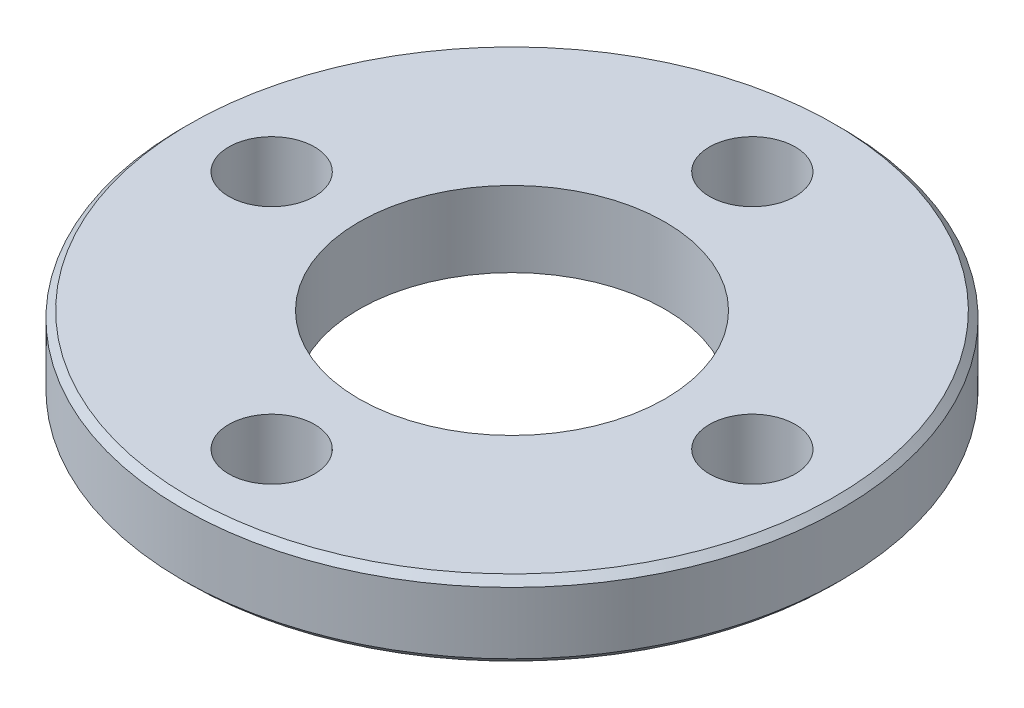
ISO-10303-21;
HEADER;
FILE_DESCRIPTION(('STEP AP214'),'2;1');
FILE_NAME('part.step','',(''),(''),'','','');
FILE_SCHEMA(('AUTOMOTIVE_DESIGN { 1 0 10303 214 1 1 1 1 }'));
ENDSEC;
DATA;
#1=APPLICATION_CONTEXT('core data for automotive mechanical design processes');
#2=APPLICATION_PROTOCOL_DEFINITION('international standard','automotive_design',2000,#1);
#3=PRODUCT_CONTEXT('',#1,'mechanical');
#4=PRODUCT('Part','Part','',(#3));
#5=PRODUCT_RELATED_PRODUCT_CATEGORY('part','',(#4));
#6=PRODUCT_DEFINITION_FORMATION('','',#4);
#7=PRODUCT_DEFINITION_CONTEXT('part definition',#1,'design');
#8=PRODUCT_DEFINITION('design','',#6,#7);
#9=PRODUCT_DEFINITION_SHAPE('','',#8);
#10=(LENGTH_UNIT() NAMED_UNIT(*) SI_UNIT(.MILLI.,.METRE.));
#11=(NAMED_UNIT(*) PLANE_ANGLE_UNIT() SI_UNIT($,.RADIAN.));
#12=(NAMED_UNIT(*) SI_UNIT($,.STERADIAN.) SOLID_ANGLE_UNIT());
#13=UNCERTAINTY_MEASURE_WITH_UNIT(LENGTH_MEASURE(1.E-05),#10,'distance_accuracy_value','');
#14=(GEOMETRIC_REPRESENTATION_CONTEXT(3) GLOBAL_UNCERTAINTY_ASSIGNED_CONTEXT((#13)) GLOBAL_UNIT_ASSIGNED_CONTEXT((#10,
#11,#12)) REPRESENTATION_CONTEXT('',''));
#15=CARTESIAN_POINT('',(0.,0.,0.));
#16=DIRECTION('',(0.,0.,1.));
#17=DIRECTION('',(1.,0.,0.));
#18=AXIS2_PLACEMENT_3D('',#15,#16,#17);
#19=CARTESIAN_POINT('',(6.99999812689985,-18.112,0.));
#20=DIRECTION('',(0.,1.,0.));
#21=DIRECTION('',(0.,0.,1.));
#22=AXIS2_PLACEMENT_3D('',#19,#20,#21);
#23=CYLINDRICAL_SURFACE('',#22,1.25);
#24=CARTESIAN_POINT('',(6.99999812689985,-18.05,0.));
#25=DIRECTION('',(0.,-1.,0.));
#26=DIRECTION('',(0.,0.,-1.));
#27=AXIS2_PLACEMENT_3D('',#24,#25,#26);
#28=CIRCLE('',#27,1.25);
#29=CARTESIAN_POINT('',(6.99999812689985,-18.05,-1.25));
#30=VERTEX_POINT('',#29);
#31=EDGE_CURVE('E219',#30,#30,#28,.T.);
#32=ORIENTED_EDGE('',*,*,#31,.T.);
#33=DIRECTION('',(0.,1.,0.));
#34=VECTOR('',#33,1.);
#35=CARTESIAN_POINT('',(6.99999812689985,-18.112,-1.25));
#36=LINE('',#35,#34);
#37=CARTESIAN_POINT('',(6.99999812689983,-15.85,-1.25));
#38=VERTEX_POINT('',#37);
#39=EDGE_CURVE('E11',#30,#38,#36,.T.);
#40=ORIENTED_EDGE('',*,*,#39,.T.);
#41=CARTESIAN_POINT('',(6.99999812689983,-15.85,0.));
#42=DIRECTION('',(0.,1.,0.));
#43=DIRECTION('',(0.,0.,1.));
#44=AXIS2_PLACEMENT_3D('',#41,#42,#43);
#45=CIRCLE('',#44,1.25);
#46=EDGE_CURVE('E173',#38,#38,#45,.T.);
#47=ORIENTED_EDGE('',*,*,#46,.T.);
#48=ORIENTED_EDGE('',*,*,#39,.F.);
#49=EDGE_LOOP('',(#32,#40,#47,#48));
#50=FACE_BOUND('',#49,.T.);
#51=ADVANCED_FACE('F54',(#50),#23,.F.);
#52=CARTESIAN_POINT('',(-1.52655665885959E-13,-18.1120000000001,6.9999981269));
#53=DIRECTION('',(0.,1.,0.));
#54=DIRECTION('',(-1.,0.,0.));
#55=AXIS2_PLACEMENT_3D('',#52,#53,#54);
#56=CYLINDRICAL_SURFACE('',#55,1.25);
#57=CARTESIAN_POINT('',(-1.52655665885959E-13,-18.0500000000001,6.9999981269));
#58=DIRECTION('',(0.,-1.,0.));
#59=DIRECTION('',(1.,0.,0.));
#60=AXIS2_PLACEMENT_3D('',#57,#58,#59);
#61=CIRCLE('',#60,1.25);
#62=CARTESIAN_POINT('',(1.24999999999985,-18.0500000000001,6.9999981269));
#63=VERTEX_POINT('',#62);
#64=EDGE_CURVE('E224',#63,#63,#61,.T.);
#65=ORIENTED_EDGE('',*,*,#64,.T.);
#66=DIRECTION('',(0.,1.,0.));
#67=VECTOR('',#66,1.);
#68=CARTESIAN_POINT('',(1.24999999999985,-18.1120000000001,6.9999981269));
#69=LINE('',#68,#67);
#70=CARTESIAN_POINT('',(1.24999999999983,-15.8500000000001,6.9999981269));
#71=VERTEX_POINT('',#70);
#72=EDGE_CURVE('E61',#63,#71,#69,.T.);
#73=ORIENTED_EDGE('',*,*,#72,.T.);
#74=CARTESIAN_POINT('',(-1.6826817716975E-13,-15.8500000000001,6.9999981269));
#75=DIRECTION('',(0.,1.,0.));
#76=DIRECTION('',(-1.,0.,0.));
#77=AXIS2_PLACEMENT_3D('',#74,#75,#76);
#78=CIRCLE('',#77,1.25);
#79=EDGE_CURVE('E167',#71,#71,#78,.T.);
#80=ORIENTED_EDGE('',*,*,#79,.T.);
#81=ORIENTED_EDGE('',*,*,#72,.F.);
#82=EDGE_LOOP('',(#65,#73,#80,#81));
#83=FACE_BOUND('',#82,.T.);
#84=ADVANCED_FACE('F281',(#83),#56,.F.);
#85=CARTESIAN_POINT('',(-6.99999812690015,-18.1120000000001,0.));
#86=DIRECTION('',(0.,1.,0.));
#87=DIRECTION('',(0.,0.,-1.));
#88=AXIS2_PLACEMENT_3D('',#85,#86,#87);
#89=CYLINDRICAL_SURFACE('',#88,1.25);
#90=CARTESIAN_POINT('',(-6.99999812690015,-18.0500000000001,0.));
#91=DIRECTION('',(0.,-1.,0.));
#92=DIRECTION('',(0.,0.,1.));
#93=AXIS2_PLACEMENT_3D('',#90,#91,#92);
#94=CIRCLE('',#93,1.25);
#95=CARTESIAN_POINT('',(-6.99999812690015,-18.0500000000001,1.25));
#96=VERTEX_POINT('',#95);
#97=EDGE_CURVE('E229',#96,#96,#94,.T.);
#98=ORIENTED_EDGE('',*,*,#97,.T.);
#99=DIRECTION('',(0.,1.,0.));
#100=VECTOR('',#99,1.);
#101=CARTESIAN_POINT('',(-6.99999812690015,-18.1120000000001,1.25));
#102=LINE('',#101,#100);
#103=CARTESIAN_POINT('',(-6.99999812690017,-15.8500000000001,1.25));
#104=VERTEX_POINT('',#103);
#105=EDGE_CURVE('E177',#96,#104,#102,.T.);
#106=ORIENTED_EDGE('',*,*,#105,.T.);
#107=CARTESIAN_POINT('',(-6.99999812690017,-15.8500000000001,0.));
#108=DIRECTION('',(0.,1.,0.));
#109=DIRECTION('',(0.,0.,-1.));
#110=AXIS2_PLACEMENT_3D('',#107,#108,#109);
#111=CIRCLE('',#110,1.25);
#112=EDGE_CURVE('E168',#104,#104,#111,.T.);
#113=ORIENTED_EDGE('',*,*,#112,.T.);
#114=ORIENTED_EDGE('',*,*,#105,.F.);
#115=EDGE_LOOP('',(#98,#106,#113,#114));
#116=FACE_BOUND('',#115,.T.);
#117=ADVANCED_FACE('F287',(#116),#89,.F.);
#118=CARTESIAN_POINT('',(-1.52655665885959E-13,-18.1120000000001,-6.9999981269));
#119=DIRECTION('',(0.,1.,0.));
#120=DIRECTION('',(1.,0.,0.));
#121=AXIS2_PLACEMENT_3D('',#118,#119,#120);
#122=CYLINDRICAL_SURFACE('',#121,1.25);
#123=CARTESIAN_POINT('',(-1.52655665885959E-13,-18.0500000000001,-6.9999981269));
#124=DIRECTION('',(0.,-1.,0.));
#125=DIRECTION('',(-1.,0.,0.));
#126=AXIS2_PLACEMENT_3D('',#123,#124,#125);
#127=CIRCLE('',#126,1.25);
#128=CARTESIAN_POINT('',(-1.25000000000015,-18.0500000000001,-6.9999981269));
#129=VERTEX_POINT('',#128);
#130=EDGE_CURVE('E222',#129,#129,#127,.T.);
#131=ORIENTED_EDGE('',*,*,#130,.T.);
#132=DIRECTION('',(0.,1.,0.));
#133=VECTOR('',#132,1.);
#134=CARTESIAN_POINT('',(-1.25000000000015,-18.1120000000001,-6.9999981269));
#135=LINE('',#134,#133);
#136=CARTESIAN_POINT('',(-1.25000000000017,-15.8500000000001,-6.9999981269));
#137=VERTEX_POINT('',#136);
#138=EDGE_CURVE('E176',#129,#137,#135,.T.);
#139=ORIENTED_EDGE('',*,*,#138,.T.);
#140=CARTESIAN_POINT('',(-1.6826817716975E-13,-15.8500000000001,-6.9999981269));
#141=DIRECTION('',(0.,1.,0.));
#142=DIRECTION('',(1.,0.,0.));
#143=AXIS2_PLACEMENT_3D('',#140,#141,#142);
#144=CIRCLE('',#143,1.25);
#145=EDGE_CURVE('E162',#137,#137,#144,.T.);
#146=ORIENTED_EDGE('',*,*,#145,.T.);
#147=ORIENTED_EDGE('',*,*,#138,.F.);
#148=EDGE_LOOP('',(#131,#139,#146,#147));
#149=FACE_BOUND('',#148,.T.);
#150=ADVANCED_FACE('F295',(#149),#122,.F.);
#151=CARTESIAN_POINT('',(-1.6826817716975E-13,-15.8500000000001,0.));
#152=DIRECTION('',(0.,-1.,0.));
#153=DIRECTION('',(-1.,0.,0.));
#154=AXIS2_PLACEMENT_3D('',#151,#152,#153);
#155=PLANE('',#154);
#156=ORIENTED_EDGE('',*,*,#46,.F.);
#157=EDGE_LOOP('',(#156));
#158=FACE_BOUND('',#157,.T.);
#159=ORIENTED_EDGE('',*,*,#79,.F.);
#160=EDGE_LOOP('',(#159));
#161=FACE_BOUND('',#160,.T.);
#162=ORIENTED_EDGE('',*,*,#112,.F.);
#163=EDGE_LOOP('',(#162));
#164=FACE_BOUND('',#163,.T.);
#165=ORIENTED_EDGE('',*,*,#145,.F.);
#166=EDGE_LOOP('',(#165));
#167=FACE_BOUND('',#166,.T.);
#168=CARTESIAN_POINT('',(1.1095E-13,-15.8500000000001,0.));
#169=DIRECTION('',(0.,-1.,0.));
#170=DIRECTION('',(1.,0.,0.));
#171=AXIS2_PLACEMENT_3D('',#168,#169,#170);
#172=CIRCLE('',#171,4.45999999999972);
#173=CARTESIAN_POINT('',(4.45999999999983,-15.85,0.));
#174=VERTEX_POINT('',#173);
#175=EDGE_CURVE('E250',#174,#174,#172,.T.);
#176=ORIENTED_EDGE('',*,*,#175,.T.);
#177=EDGE_LOOP('',(#176));
#178=FACE_BOUND('',#177,.T.);
#179=CARTESIAN_POINT('',(-1.6826817716975E-13,-15.8500000000001,0.));
#180=DIRECTION('',(0.,-1.,0.));
#181=DIRECTION('',(1.,0.,0.));
#182=AXIS2_PLACEMENT_3D('',#179,#180,#181);
#183=CIRCLE('',#182,9.400000000004);
#184=CARTESIAN_POINT('',(-1.6826817716975E-13,-15.8500000000001,9.400000000004));
#185=VERTEX_POINT('',#184);
#186=EDGE_CURVE('E160',#185,#185,#183,.T.);
#187=ORIENTED_EDGE('',*,*,#186,.F.);
#188=EDGE_LOOP('',(#187));
#189=FACE_BOUND('',#188,.T.);
#190=ADVANCED_FACE('F293',(#158,#161,#164,#167,#178,#189),#155,.F.);
#191=CARTESIAN_POINT('',(-1.66533453693773E-13,-15.9500000000001,0.));
#192=DIRECTION('',(0.,-1.,0.));
#193=DIRECTION('',(0.,0.,-1.));
#194=AXIS2_PLACEMENT_3D('',#191,#192,#193);
#195=CONICAL_SURFACE('',#194,9.500000000004,0.785398163395);
#196=CARTESIAN_POINT('',(-1.66533453693773E-13,-16.0500000000001,0.));
#197=DIRECTION('',(0.,-1.,0.));
#198=DIRECTION('',(1.,0.,1.5111036E-10));
#199=AXIS2_PLACEMENT_3D('',#196,#197,#198);
#200=CIRCLE('',#199,9.600000000004);
#201=CARTESIAN_POINT('',(-1.66533453693773E-13,-16.0500000000001,9.600000000004));
#202=VERTEX_POINT('',#201);
#203=CARTESIAN_POINT('',(9.59999999999983,-16.05,0.));
#204=VERTEX_POINT('',#203);
#205=EDGE_CURVE('E139',#202,#204,#200,.T.);
#206=ORIENTED_EDGE('',*,*,#205,.F.);
#207=DIRECTION('',(0.,0.707106781188048,-0.707106781185048));
#208=VECTOR('',#207,1.);
#209=CARTESIAN_POINT('',(-1.66533453693773E-13,-15.9500000000001,9.500000000004));
#210=LINE('',#209,#208);
#211=EDGE_CURVE('E137',#202,#185,#210,.T.);
#212=ORIENTED_EDGE('',*,*,#211,.T.);
#213=ORIENTED_EDGE('',*,*,#186,.T.);
#214=ORIENTED_EDGE('',*,*,#211,.F.);
#215=CARTESIAN_POINT('',(-1.66533453693773E-13,-16.0500000000001,0.));
#216=DIRECTION('',(0.,-1.,0.));
#217=DIRECTION('',(1.,0.,1.5111036E-10));
#218=AXIS2_PLACEMENT_3D('',#215,#216,#217);
#219=CIRCLE('',#218,9.600000000004);
#220=EDGE_CURVE('E135',#204,#202,#219,.T.);
#221=ORIENTED_EDGE('',*,*,#220,.F.);
#222=EDGE_LOOP('',(#206,#212,#213,#214,#221));
#223=FACE_BOUND('',#222,.T.);
#224=ADVANCED_FACE('F131',(#223),#195,.T.);
#225=CARTESIAN_POINT('',(-1.54390389361936E-13,-17.9040000000001,0.));
#226=DIRECTION('',(0.,1.,0.));
#227=DIRECTION('',(-1.,0.,0.));
#228=AXIS2_PLACEMENT_3D('',#225,#226,#227);
#229=CYLINDRICAL_SURFACE('',#228,9.6);
#230=ORIENTED_EDGE('',*,*,#205,.T.);
#231=DIRECTION('',(0.,-1.,0.));
#232=VECTOR('',#231,1.);
#233=CARTESIAN_POINT('',(9.59999999999985,-17.904,0.));
#234=LINE('',#233,#232);
#235=CARTESIAN_POINT('',(9.59999999999985,-17.85,0.));
#236=VERTEX_POINT('',#235);
#237=EDGE_CURVE('E142',#204,#236,#234,.T.);
#238=ORIENTED_EDGE('',*,*,#237,.T.);
#239=CARTESIAN_POINT('',(-1.54390389361936E-13,-17.8500000000001,0.));
#240=DIRECTION('',(0.,1.,0.));
#241=DIRECTION('',(0.,0.,1.));
#242=AXIS2_PLACEMENT_3D('',#239,#240,#241);
#243=CIRCLE('',#242,9.600000000002);
#244=CARTESIAN_POINT('',(-1.54390389361936E-13,-17.8500000000001,9.600000000002));
#245=VERTEX_POINT('',#244);
#246=EDGE_CURVE('E213',#236,#245,#243,.T.);
#247=ORIENTED_EDGE('',*,*,#246,.T.);
#248=CARTESIAN_POINT('',(-1.54390389361936E-13,-17.8500000000001,0.));
#249=DIRECTION('',(0.,1.,0.));
#250=DIRECTION('',(0.,0.,1.));
#251=AXIS2_PLACEMENT_3D('',#248,#249,#250);
#252=CIRCLE('',#251,9.600000000002);
#253=EDGE_CURVE('E150',#245,#236,#252,.T.);
#254=ORIENTED_EDGE('',*,*,#253,.T.);
#255=ORIENTED_EDGE('',*,*,#237,.F.);
#256=ORIENTED_EDGE('',*,*,#220,.T.);
#257=EDGE_LOOP('',(#230,#238,#247,#254,#255,#256));
#258=FACE_BOUND('',#257,.T.);
#259=ADVANCED_FACE('F144',(#258),#229,.T.);
#260=CARTESIAN_POINT('',(-1.52655665885959E-13,-17.9500000000001,0.));
#261=DIRECTION('',(0.,1.,0.));
#262=DIRECTION('',(0.,0.,-1.));
#263=AXIS2_PLACEMENT_3D('',#260,#261,#262);
#264=CONICAL_SURFACE('',#263,9.499999999999,0.785398163413999);
#265=ORIENTED_EDGE('',*,*,#246,.F.);
#266=ORIENTED_EDGE('',*,*,#253,.F.);
#267=DIRECTION('',(0.,-0.707106781175048,-0.707106781198048));
#268=VECTOR('',#267,1.);
#269=CARTESIAN_POINT('',(-1.52655665885959E-13,-17.9500000000001,9.499999999999));
#270=LINE('',#269,#268);
#271=CARTESIAN_POINT('',(-1.52655665885959E-13,-18.0500000000001,9.399999999996));
#272=VERTEX_POINT('',#271);
#273=EDGE_CURVE('E155',#245,#272,#270,.T.);
#274=ORIENTED_EDGE('',*,*,#273,.T.);
#275=CARTESIAN_POINT('',(-1.52655665885959E-13,-18.0500000000001,0.));
#276=DIRECTION('',(0.,1.,0.));
#277=DIRECTION('',(1.,0.,0.));
#278=AXIS2_PLACEMENT_3D('',#275,#276,#277);
#279=CIRCLE('',#278,9.399999999997);
#280=EDGE_CURVE('E237',#272,#272,#279,.T.);
#281=ORIENTED_EDGE('',*,*,#280,.T.);
#282=ORIENTED_EDGE('',*,*,#273,.F.);
#283=EDGE_LOOP('',(#265,#266,#274,#281,#282));
#284=FACE_BOUND('',#283,.T.);
#285=ADVANCED_FACE('F261',(#284),#264,.T.);
#286=CARTESIAN_POINT('',(-1.52655665885959E-13,-18.0500000000001,0.));
#287=DIRECTION('',(0.,-1.,0.));
#288=DIRECTION('',(-1.,0.,0.));
#289=AXIS2_PLACEMENT_3D('',#286,#287,#288);
#290=PLANE('',#289);
#291=CARTESIAN_POINT('',(1.2635E-13,-18.0500000000001,0.));
#292=DIRECTION('',(0.,-1.,0.));
#293=DIRECTION('',(1.,0.,0.));
#294=AXIS2_PLACEMENT_3D('',#291,#292,#293);
#295=CIRCLE('',#294,4.45999999999972);
#296=CARTESIAN_POINT('',(4.45999999999985,-18.05,0.));
#297=VERTEX_POINT('',#296);
#298=EDGE_CURVE('E59',#297,#297,#295,.T.);
#299=ORIENTED_EDGE('',*,*,#298,.F.);
#300=EDGE_LOOP('',(#299));
#301=FACE_BOUND('',#300,.T.);
#302=ORIENTED_EDGE('',*,*,#64,.F.);
#303=EDGE_LOOP('',(#302));
#304=FACE_BOUND('',#303,.T.);
#305=ORIENTED_EDGE('',*,*,#31,.F.);
#306=EDGE_LOOP('',(#305));
#307=FACE_BOUND('',#306,.T.);
#308=ORIENTED_EDGE('',*,*,#130,.F.);
#309=EDGE_LOOP('',(#308));
#310=FACE_BOUND('',#309,.T.);
#311=ORIENTED_EDGE('',*,*,#97,.F.);
#312=EDGE_LOOP('',(#311));
#313=FACE_BOUND('',#312,.T.);
#314=ORIENTED_EDGE('',*,*,#280,.F.);
#315=EDGE_LOOP('',(#314));
#316=FACE_BOUND('',#315,.T.);
#317=ADVANCED_FACE('F262',(#301,#304,#307,#310,#313,#316),#290,.T.);
#318=CARTESIAN_POINT('',(1.38156696116311E-13,-19.7366708737588,0.));
#319=DIRECTION('',(0.,1.,0.));
#320=DIRECTION('',(-1.,0.,0.));
#321=AXIS2_PLACEMENT_3D('',#318,#319,#320);
#322=CYLINDRICAL_SURFACE('',#321,4.45999999999972);
#323=ORIENTED_EDGE('',*,*,#298,.T.);
#324=EDGE_LOOP('',(#323));
#325=FACE_BOUND('',#324,.T.);
#326=ORIENTED_EDGE('',*,*,#175,.F.);
#327=EDGE_LOOP('',(#326));
#328=FACE_BOUND('',#327,.T.);
#329=ADVANCED_FACE('F259',(#325,#328),#322,.F.);
#330=CLOSED_SHELL('',(#51,#84,#117,#150,#190,#224,#259,#285,#317,#329));
#331=MANIFOLD_SOLID_BREP('B2',#330);
#332=ADVANCED_BREP_SHAPE_REPRESENTATION('',(#18,#331),#14);
#333=SHAPE_DEFINITION_REPRESENTATION(#9,#332);
ENDSEC;
END-ISO-10303-21;
